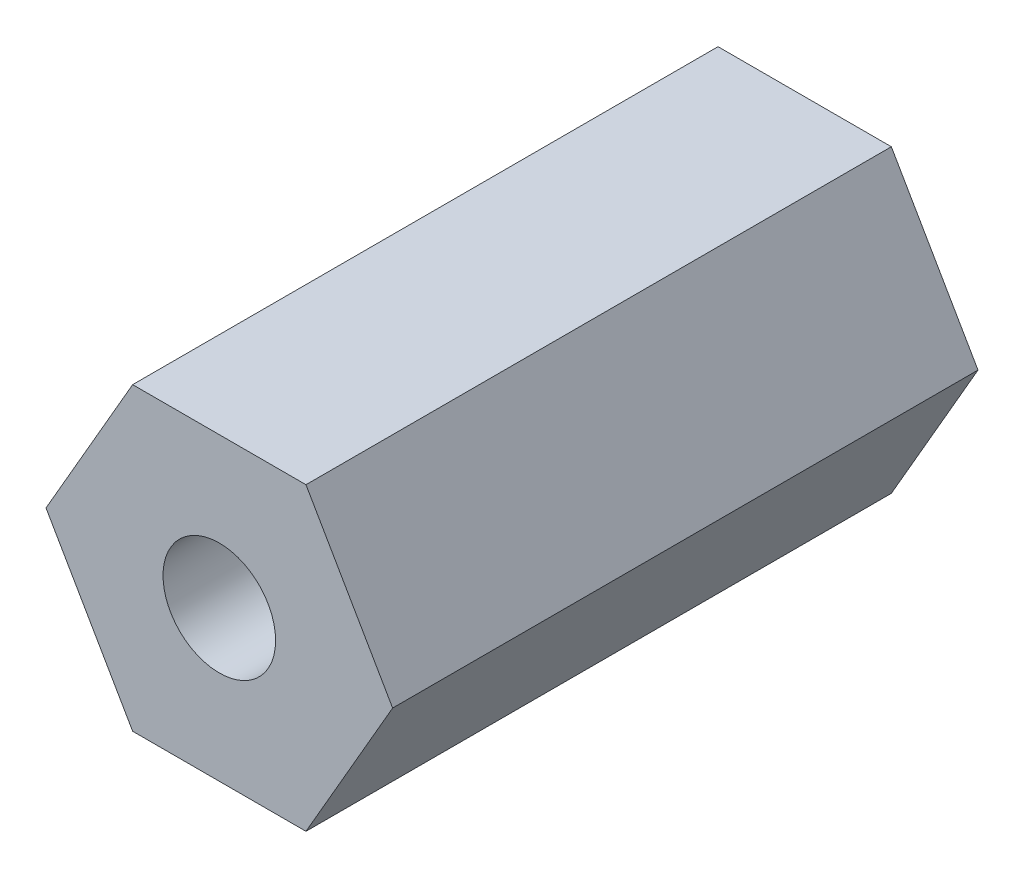
ISO-10303-21;
HEADER;
FILE_DESCRIPTION(('STEP AP214'),'2;1');
FILE_NAME('part.step','',(''),(''),'','','');
FILE_SCHEMA(('AUTOMOTIVE_DESIGN { 1 0 10303 214 1 1 1 1 }'));
ENDSEC;
DATA;
#1=APPLICATION_CONTEXT('core data for automotive mechanical design processes');
#2=APPLICATION_PROTOCOL_DEFINITION('international standard','automotive_design',2000,#1);
#3=PRODUCT_CONTEXT('',#1,'mechanical');
#4=PRODUCT('Part','Part','',(#3));
#5=PRODUCT_RELATED_PRODUCT_CATEGORY('part','',(#4));
#6=PRODUCT_DEFINITION_FORMATION('','',#4);
#7=PRODUCT_DEFINITION_CONTEXT('part definition',#1,'design');
#8=PRODUCT_DEFINITION('design','',#6,#7);
#9=PRODUCT_DEFINITION_SHAPE('','',#8);
#10=(LENGTH_UNIT() NAMED_UNIT(*) SI_UNIT(.MILLI.,.METRE.));
#11=(NAMED_UNIT(*) PLANE_ANGLE_UNIT() SI_UNIT($,.RADIAN.));
#12=(NAMED_UNIT(*) SI_UNIT($,.STERADIAN.) SOLID_ANGLE_UNIT());
#13=UNCERTAINTY_MEASURE_WITH_UNIT(LENGTH_MEASURE(1.E-05),#10,'distance_accuracy_value','');
#14=(GEOMETRIC_REPRESENTATION_CONTEXT(3) GLOBAL_UNCERTAINTY_ASSIGNED_CONTEXT((#13)) GLOBAL_UNIT_ASSIGNED_CONTEXT((#10,
#11,#12)) REPRESENTATION_CONTEXT('',''));
#15=CARTESIAN_POINT('',(0.,0.,0.));
#16=DIRECTION('',(0.,0.,1.));
#17=DIRECTION('',(1.,0.,0.));
#18=AXIS2_PLACEMENT_3D('',#15,#16,#17);
#19=CARTESIAN_POINT('',(0.,0.,15.6));
#20=DIRECTION('',(0.,0.,1.));
#21=DIRECTION('',(1.,0.,0.));
#22=AXIS2_PLACEMENT_3D('',#19,#20,#21);
#23=PLANE('',#22);
#24=DIRECTION('',(-0.5,0.866025403784438,0.));
#25=VECTOR('',#24,1.);
#26=CARTESIAN_POINT('',(4.61880215351701,0.,15.6));
#27=LINE('',#26,#25);
#28=CARTESIAN_POINT('',(4.61880215351701,0.,15.6));
#29=VERTEX_POINT('',#28);
#30=CARTESIAN_POINT('',(2.3094010767585,4.,15.6));
#31=VERTEX_POINT('',#30);
#32=EDGE_CURVE('E131',#29,#31,#27,.T.);
#33=ORIENTED_EDGE('',*,*,#32,.T.);
#34=DIRECTION('',(-1.,0.,0.));
#35=VECTOR('',#34,1.);
#36=CARTESIAN_POINT('',(2.3094010767585,4.,15.6));
#37=LINE('',#36,#35);
#38=CARTESIAN_POINT('',(-2.3094010767585,4.,15.6));
#39=VERTEX_POINT('',#38);
#40=EDGE_CURVE('E89',#31,#39,#37,.T.);
#41=ORIENTED_EDGE('',*,*,#40,.T.);
#42=DIRECTION('',(-0.5,-0.866025403784439,0.));
#43=VECTOR('',#42,1.);
#44=CARTESIAN_POINT('',(-2.3094010767585,4.,15.6));
#45=LINE('',#44,#43);
#46=CARTESIAN_POINT('',(-4.618802153517,0.,15.6));
#47=VERTEX_POINT('',#46);
#48=EDGE_CURVE('E102',#39,#47,#45,.T.);
#49=ORIENTED_EDGE('',*,*,#48,.T.);
#50=DIRECTION('',(0.5,-0.866025403784438,0.));
#51=VECTOR('',#50,1.);
#52=CARTESIAN_POINT('',(-4.618802153517,0.,15.6));
#53=LINE('',#52,#51);
#54=CARTESIAN_POINT('',(-2.3094010767585,-4.,15.6));
#55=VERTEX_POINT('',#54);
#56=EDGE_CURVE('E96',#47,#55,#53,.T.);
#57=ORIENTED_EDGE('',*,*,#56,.T.);
#58=DIRECTION('',(1.,0.,0.));
#59=VECTOR('',#58,1.);
#60=CARTESIAN_POINT('',(-2.3094010767585,-4.,15.6));
#61=LINE('',#60,#59);
#62=CARTESIAN_POINT('',(2.3094010767585,-4.,15.6));
#63=VERTEX_POINT('',#62);
#64=EDGE_CURVE('E100',#55,#63,#61,.T.);
#65=ORIENTED_EDGE('',*,*,#64,.T.);
#66=DIRECTION('',(0.5,0.866025403784439,0.));
#67=VECTOR('',#66,1.);
#68=CARTESIAN_POINT('',(2.3094010767585,-4.,15.6));
#69=LINE('',#68,#67);
#70=EDGE_CURVE('E52',#63,#29,#69,.T.);
#71=ORIENTED_EDGE('',*,*,#70,.T.);
#72=EDGE_LOOP('',(#33,#41,#49,#57,#65,#71));
#73=FACE_BOUND('',#72,.T.);
#74=CARTESIAN_POINT('',(0.,0.,15.6));
#75=DIRECTION('',(0.,0.,1.));
#76=DIRECTION('',(1.,0.,0.));
#77=AXIS2_PLACEMENT_3D('',#74,#75,#76);
#78=CIRCLE('',#77,1.5);
#79=CARTESIAN_POINT('',(1.5,0.,15.6));
#80=VERTEX_POINT('',#79);
#81=EDGE_CURVE('E124',#80,#80,#78,.T.);
#82=ORIENTED_EDGE('',*,*,#81,.F.);
#83=EDGE_LOOP('',(#82));
#84=FACE_BOUND('',#83,.T.);
#85=ADVANCED_FACE('F35',(#73,#84),#23,.T.);
#86=CARTESIAN_POINT('',(0.,0.,0.));
#87=DIRECTION('',(0.,0.,1.));
#88=DIRECTION('',(1.,0.,0.));
#89=AXIS2_PLACEMENT_3D('',#86,#87,#88);
#90=PLANE('',#89);
#91=DIRECTION('',(-0.5,0.866025403784438,0.));
#92=VECTOR('',#91,1.);
#93=CARTESIAN_POINT('',(4.61880215351701,0.,0.));
#94=LINE('',#93,#92);
#95=CARTESIAN_POINT('',(4.61880215351701,0.,0.));
#96=VERTEX_POINT('',#95);
#97=CARTESIAN_POINT('',(2.3094010767585,4.,0.));
#98=VERTEX_POINT('',#97);
#99=EDGE_CURVE('E120',#96,#98,#94,.T.);
#100=ORIENTED_EDGE('',*,*,#99,.F.);
#101=DIRECTION('',(0.5,0.866025403784439,0.));
#102=VECTOR('',#101,1.);
#103=CARTESIAN_POINT('',(2.3094010767585,-4.,0.));
#104=LINE('',#103,#102);
#105=CARTESIAN_POINT('',(2.3094010767585,-4.,0.));
#106=VERTEX_POINT('',#105);
#107=EDGE_CURVE('E81',#106,#96,#104,.T.);
#108=ORIENTED_EDGE('',*,*,#107,.F.);
#109=DIRECTION('',(1.,0.,0.));
#110=VECTOR('',#109,1.);
#111=CARTESIAN_POINT('',(-2.3094010767585,-4.,0.));
#112=LINE('',#111,#110);
#113=CARTESIAN_POINT('',(-2.3094010767585,-4.,0.));
#114=VERTEX_POINT('',#113);
#115=EDGE_CURVE('E75',#114,#106,#112,.T.);
#116=ORIENTED_EDGE('',*,*,#115,.F.);
#117=DIRECTION('',(0.5,-0.866025403784438,0.));
#118=VECTOR('',#117,1.);
#119=CARTESIAN_POINT('',(-4.618802153517,0.,0.));
#120=LINE('',#119,#118);
#121=CARTESIAN_POINT('',(-4.618802153517,0.,0.));
#122=VERTEX_POINT('',#121);
#123=EDGE_CURVE('E110',#122,#114,#120,.T.);
#124=ORIENTED_EDGE('',*,*,#123,.F.);
#125=DIRECTION('',(-0.5,-0.866025403784439,0.));
#126=VECTOR('',#125,1.);
#127=CARTESIAN_POINT('',(-2.3094010767585,4.,0.));
#128=LINE('',#127,#126);
#129=CARTESIAN_POINT('',(-2.3094010767585,4.,0.));
#130=VERTEX_POINT('',#129);
#131=EDGE_CURVE('E126',#130,#122,#128,.T.);
#132=ORIENTED_EDGE('',*,*,#131,.F.);
#133=DIRECTION('',(-1.,0.,0.));
#134=VECTOR('',#133,1.);
#135=CARTESIAN_POINT('',(2.3094010767585,4.,0.));
#136=LINE('',#135,#134);
#137=EDGE_CURVE('E123',#98,#130,#136,.T.);
#138=ORIENTED_EDGE('',*,*,#137,.F.);
#139=EDGE_LOOP('',(#100,#108,#116,#124,#132,#138));
#140=FACE_BOUND('',#139,.T.);
#141=CARTESIAN_POINT('',(0.,0.,0.));
#142=DIRECTION('',(0.,0.,1.));
#143=DIRECTION('',(1.,0.,0.));
#144=AXIS2_PLACEMENT_3D('',#141,#142,#143);
#145=CIRCLE('',#144,1.5);
#146=CARTESIAN_POINT('',(1.5,0.,0.));
#147=VERTEX_POINT('',#146);
#148=EDGE_CURVE('E224',#147,#147,#145,.T.);
#149=ORIENTED_EDGE('',*,*,#148,.T.);
#150=EDGE_LOOP('',(#149));
#151=FACE_BOUND('',#150,.T.);
#152=ADVANCED_FACE('F140',(#140,#151),#90,.F.);
#153=CARTESIAN_POINT('',(4.61880215351701,0.,15.6));
#154=DIRECTION('',(-0.866025403784439,-0.5,0.));
#155=DIRECTION('',(0.5,-0.866025403784439,0.));
#156=AXIS2_PLACEMENT_3D('',#153,#154,#155);
#157=PLANE('',#156);
#158=ORIENTED_EDGE('',*,*,#99,.T.);
#159=DIRECTION('',(0.,0.,-1.));
#160=VECTOR('',#159,1.);
#161=CARTESIAN_POINT('',(2.3094010767585,4.,15.6));
#162=LINE('',#161,#160);
#163=EDGE_CURVE('E11',#31,#98,#162,.T.);
#164=ORIENTED_EDGE('',*,*,#163,.F.);
#165=ORIENTED_EDGE('',*,*,#32,.F.);
#166=DIRECTION('',(0.,0.,-1.));
#167=VECTOR('',#166,1.);
#168=CARTESIAN_POINT('',(4.61880215351701,0.,15.6));
#169=LINE('',#168,#167);
#170=EDGE_CURVE('E116',#29,#96,#169,.T.);
#171=ORIENTED_EDGE('',*,*,#170,.T.);
#172=EDGE_LOOP('',(#158,#164,#165,#171));
#173=FACE_BOUND('',#172,.T.);
#174=ADVANCED_FACE('F37',(#173),#157,.F.);
#175=CARTESIAN_POINT('',(2.3094010767585,4.,15.6));
#176=DIRECTION('',(0.,-1.,0.));
#177=DIRECTION('',(0.,0.,-1.));
#178=AXIS2_PLACEMENT_3D('',#175,#176,#177);
#179=PLANE('',#178);
#180=ORIENTED_EDGE('',*,*,#137,.T.);
#181=DIRECTION('',(0.,0.,-1.));
#182=VECTOR('',#181,1.);
#183=CARTESIAN_POINT('',(-2.3094010767585,4.,15.6));
#184=LINE('',#183,#182);
#185=EDGE_CURVE('E44',#39,#130,#184,.T.);
#186=ORIENTED_EDGE('',*,*,#185,.F.);
#187=ORIENTED_EDGE('',*,*,#40,.F.);
#188=ORIENTED_EDGE('',*,*,#163,.T.);
#189=EDGE_LOOP('',(#180,#186,#187,#188));
#190=FACE_BOUND('',#189,.T.);
#191=ADVANCED_FACE('F165',(#190),#179,.F.);
#192=CARTESIAN_POINT('',(-2.3094010767585,4.,15.6));
#193=DIRECTION('',(0.866025403784439,-0.5,0.));
#194=DIRECTION('',(0.5,0.866025403784439,0.));
#195=AXIS2_PLACEMENT_3D('',#192,#193,#194);
#196=PLANE('',#195);
#197=ORIENTED_EDGE('',*,*,#131,.T.);
#198=DIRECTION('',(0.,0.,-1.));
#199=VECTOR('',#198,1.);
#200=CARTESIAN_POINT('',(-4.618802153517,0.,15.6));
#201=LINE('',#200,#199);
#202=EDGE_CURVE('E111',#47,#122,#201,.T.);
#203=ORIENTED_EDGE('',*,*,#202,.F.);
#204=ORIENTED_EDGE('',*,*,#48,.F.);
#205=ORIENTED_EDGE('',*,*,#185,.T.);
#206=EDGE_LOOP('',(#197,#203,#204,#205));
#207=FACE_BOUND('',#206,.T.);
#208=ADVANCED_FACE('F137',(#207),#196,.F.);
#209=CARTESIAN_POINT('',(-4.618802153517,0.,15.6));
#210=DIRECTION('',(0.866025403784439,0.5,0.));
#211=DIRECTION('',(-0.5,0.866025403784439,0.));
#212=AXIS2_PLACEMENT_3D('',#209,#210,#211);
#213=PLANE('',#212);
#214=ORIENTED_EDGE('',*,*,#123,.T.);
#215=DIRECTION('',(0.,0.,-1.));
#216=VECTOR('',#215,1.);
#217=CARTESIAN_POINT('',(-2.3094010767585,-4.,15.6));
#218=LINE('',#217,#216);
#219=EDGE_CURVE('E107',#55,#114,#218,.T.);
#220=ORIENTED_EDGE('',*,*,#219,.F.);
#221=ORIENTED_EDGE('',*,*,#56,.F.);
#222=ORIENTED_EDGE('',*,*,#202,.T.);
#223=EDGE_LOOP('',(#214,#220,#221,#222));
#224=FACE_BOUND('',#223,.T.);
#225=ADVANCED_FACE('F108',(#224),#213,.F.);
#226=CARTESIAN_POINT('',(-2.3094010767585,-4.,15.6));
#227=DIRECTION('',(0.,1.,0.));
#228=DIRECTION('',(-1.,0.,0.));
#229=AXIS2_PLACEMENT_3D('',#226,#227,#228);
#230=PLANE('',#229);
#231=ORIENTED_EDGE('',*,*,#115,.T.);
#232=DIRECTION('',(0.,0.,-1.));
#233=VECTOR('',#232,1.);
#234=CARTESIAN_POINT('',(2.3094010767585,-4.,15.6));
#235=LINE('',#234,#233);
#236=EDGE_CURVE('E112',#63,#106,#235,.T.);
#237=ORIENTED_EDGE('',*,*,#236,.F.);
#238=ORIENTED_EDGE('',*,*,#64,.F.);
#239=ORIENTED_EDGE('',*,*,#219,.T.);
#240=EDGE_LOOP('',(#231,#237,#238,#239));
#241=FACE_BOUND('',#240,.T.);
#242=ADVANCED_FACE('F114',(#241),#230,.F.);
#243=CARTESIAN_POINT('',(2.3094010767585,-4.,15.6));
#244=DIRECTION('',(-0.866025403784439,0.5,0.));
#245=DIRECTION('',(-0.5,-0.866025403784439,0.));
#246=AXIS2_PLACEMENT_3D('',#243,#244,#245);
#247=PLANE('',#246);
#248=ORIENTED_EDGE('',*,*,#107,.T.);
#249=ORIENTED_EDGE('',*,*,#170,.F.);
#250=ORIENTED_EDGE('',*,*,#70,.F.);
#251=ORIENTED_EDGE('',*,*,#236,.T.);
#252=EDGE_LOOP('',(#248,#249,#250,#251));
#253=FACE_BOUND('',#252,.T.);
#254=ADVANCED_FACE('F145',(#253),#247,.F.);
#255=CARTESIAN_POINT('',(0.,0.,15.6));
#256=DIRECTION('',(0.,0.,-1.));
#257=DIRECTION('',(-1.,0.,0.));
#258=AXIS2_PLACEMENT_3D('',#255,#256,#257);
#259=CYLINDRICAL_SURFACE('',#258,1.5);
#260=ORIENTED_EDGE('',*,*,#81,.T.);
#261=EDGE_LOOP('',(#260));
#262=FACE_BOUND('',#261,.T.);
#263=ORIENTED_EDGE('',*,*,#148,.F.);
#264=EDGE_LOOP('',(#263));
#265=FACE_BOUND('',#264,.T.);
#266=ADVANCED_FACE('F147',(#262,#265),#259,.F.);
#267=CLOSED_SHELL('',(#85,#152,#174,#191,#208,#225,#242,#254,#266));
#268=MANIFOLD_SOLID_BREP('B2',#267);
#269=ADVANCED_BREP_SHAPE_REPRESENTATION('',(#18,#268),#14);
#270=SHAPE_DEFINITION_REPRESENTATION(#9,#269);
ENDSEC;
END-ISO-10303-21;
